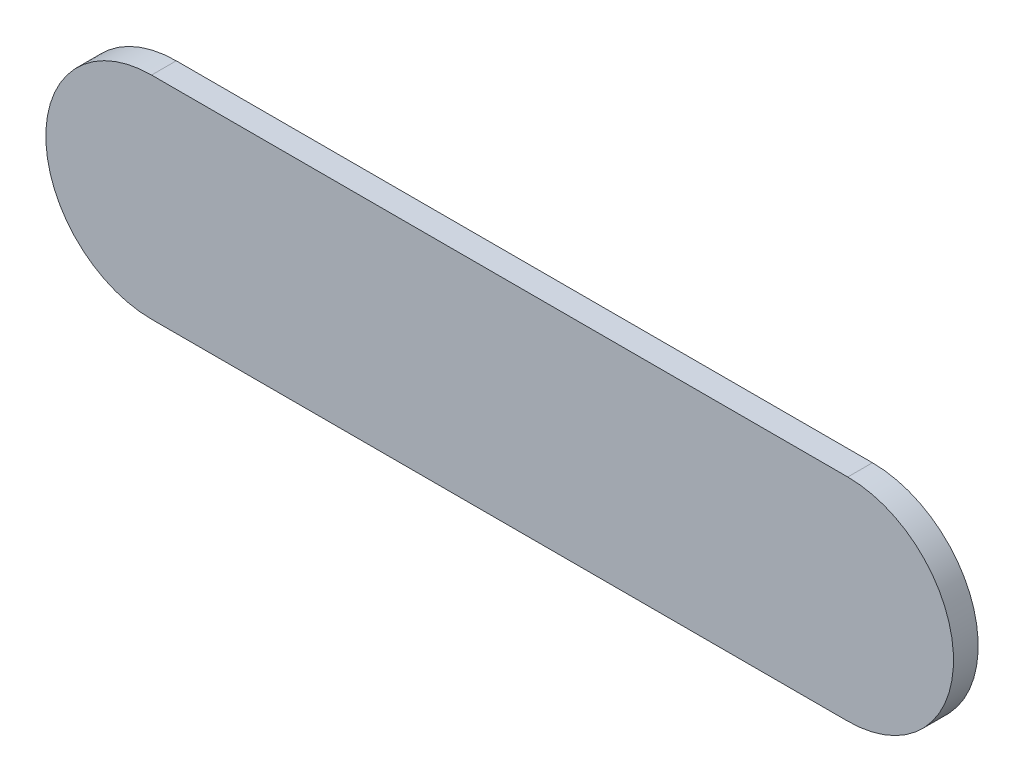
ISO-10303-21;
HEADER;
FILE_DESCRIPTION(('STEP AP214'),'2;1');
FILE_NAME('part.step','',(''),(''),'','','');
FILE_SCHEMA(('AUTOMOTIVE_DESIGN { 1 0 10303 214 1 1 1 1 }'));
ENDSEC;
DATA;
#1=APPLICATION_CONTEXT('core data for automotive mechanical design processes');
#2=APPLICATION_PROTOCOL_DEFINITION('international standard','automotive_design',2000,#1);
#3=PRODUCT_CONTEXT('',#1,'mechanical');
#4=PRODUCT('Part','Part','',(#3));
#5=PRODUCT_RELATED_PRODUCT_CATEGORY('part','',(#4));
#6=PRODUCT_DEFINITION_FORMATION('','',#4);
#7=PRODUCT_DEFINITION_CONTEXT('part definition',#1,'design');
#8=PRODUCT_DEFINITION('design','',#6,#7);
#9=PRODUCT_DEFINITION_SHAPE('','',#8);
#10=(LENGTH_UNIT() NAMED_UNIT(*) SI_UNIT(.MILLI.,.METRE.));
#11=(NAMED_UNIT(*) PLANE_ANGLE_UNIT() SI_UNIT($,.RADIAN.));
#12=(NAMED_UNIT(*) SI_UNIT($,.STERADIAN.) SOLID_ANGLE_UNIT());
#13=UNCERTAINTY_MEASURE_WITH_UNIT(LENGTH_MEASURE(1.E-05),#10,'distance_accuracy_value','');
#14=(GEOMETRIC_REPRESENTATION_CONTEXT(3) GLOBAL_UNCERTAINTY_ASSIGNED_CONTEXT((#13)) GLOBAL_UNIT_ASSIGNED_CONTEXT((#10,
#11,#12)) REPRESENTATION_CONTEXT('',''));
#15=CARTESIAN_POINT('',(0.,0.,0.));
#16=DIRECTION('',(0.,0.,1.));
#17=DIRECTION('',(1.,0.,0.));
#18=AXIS2_PLACEMENT_3D('',#15,#16,#17);
#19=CARTESIAN_POINT('',(131.4125,-63.65,1.635));
#20=DIRECTION('',(0.,0.,1.));
#21=DIRECTION('',(1.,0.,0.));
#22=AXIS2_PLACEMENT_3D('',#19,#20,#21);
#23=PLANE('',#22);
#24=DIRECTION('',(1.,0.,0.));
#25=VECTOR('',#24,1.);
#26=CARTESIAN_POINT('',(131.4125,-63.65,1.635));
#27=LINE('',#26,#25);
#28=CARTESIAN_POINT('',(131.4125,-63.65,1.635));
#29=VERTEX_POINT('',#28);
#30=CARTESIAN_POINT('',(132.4,-63.65,1.635));
#31=VERTEX_POINT('',#30);
#32=EDGE_CURVE('E70',#29,#31,#27,.T.);
#33=ORIENTED_EDGE('',*,*,#32,.T.);
#34=CARTESIAN_POINT('',(132.4,-63.5,1.635));
#35=DIRECTION('',(0.,0.,1.));
#36=DIRECTION('',(-1.894780628694E-13,-1.,0.));
#37=AXIS2_PLACEMENT_3D('',#34,#35,#36);
#38=CIRCLE('',#37,0.15);
#39=CARTESIAN_POINT('',(132.4,-63.35,1.635));
#40=VERTEX_POINT('',#39);
#41=EDGE_CURVE('E96',#31,#40,#38,.T.);
#42=ORIENTED_EDGE('',*,*,#41,.T.);
#43=DIRECTION('',(-1.,0.,0.));
#44=VECTOR('',#43,1.);
#45=CARTESIAN_POINT('',(132.4,-63.35,1.635));
#46=LINE('',#45,#44);
#47=CARTESIAN_POINT('',(131.4125,-63.35,1.635));
#48=VERTEX_POINT('',#47);
#49=EDGE_CURVE('E72',#40,#48,#46,.T.);
#50=ORIENTED_EDGE('',*,*,#49,.T.);
#51=CARTESIAN_POINT('',(131.4125,-63.5,1.635));
#52=DIRECTION('',(0.,0.,1.));
#53=DIRECTION('',(1.894780628694E-13,1.,0.));
#54=AXIS2_PLACEMENT_3D('',#51,#52,#53);
#55=CIRCLE('',#54,0.15);
#56=EDGE_CURVE('E11',#48,#29,#55,.T.);
#57=ORIENTED_EDGE('',*,*,#56,.T.);
#58=EDGE_LOOP('',(#33,#42,#50,#57));
#59=FACE_BOUND('',#58,.T.);
#60=ADVANCED_FACE('F17',(#59),#23,.T.);
#61=CARTESIAN_POINT('',(131.4125,-63.65,1.6));
#62=DIRECTION('',(0.,0.,1.));
#63=DIRECTION('',(1.,0.,0.));
#64=AXIS2_PLACEMENT_3D('',#61,#62,#63);
#65=PLANE('',#64);
#66=CARTESIAN_POINT('',(131.4125,-63.5,1.6));
#67=DIRECTION('',(0.,0.,1.));
#68=DIRECTION('',(1.894780628694E-13,1.,0.));
#69=AXIS2_PLACEMENT_3D('',#66,#67,#68);
#70=CIRCLE('',#69,0.15);
#71=CARTESIAN_POINT('',(131.4125,-63.35,1.6));
#72=VERTEX_POINT('',#71);
#73=CARTESIAN_POINT('',(131.4125,-63.65,1.6));
#74=VERTEX_POINT('',#73);
#75=EDGE_CURVE('E20',#72,#74,#70,.T.);
#76=ORIENTED_EDGE('',*,*,#75,.F.);
#77=DIRECTION('',(-1.,0.,0.));
#78=VECTOR('',#77,1.);
#79=CARTESIAN_POINT('',(132.4,-63.35,1.6));
#80=LINE('',#79,#78);
#81=CARTESIAN_POINT('',(132.4,-63.35,1.6));
#82=VERTEX_POINT('',#81);
#83=EDGE_CURVE('E99',#82,#72,#80,.T.);
#84=ORIENTED_EDGE('',*,*,#83,.F.);
#85=CARTESIAN_POINT('',(132.4,-63.5,1.6));
#86=DIRECTION('',(0.,0.,1.));
#87=DIRECTION('',(-1.894780628694E-13,-1.,0.));
#88=AXIS2_PLACEMENT_3D('',#85,#86,#87);
#89=CIRCLE('',#88,0.15);
#90=CARTESIAN_POINT('',(132.4,-63.65,1.6));
#91=VERTEX_POINT('',#90);
#92=EDGE_CURVE('E80',#91,#82,#89,.T.);
#93=ORIENTED_EDGE('',*,*,#92,.F.);
#94=DIRECTION('',(1.,0.,0.));
#95=VECTOR('',#94,1.);
#96=CARTESIAN_POINT('',(131.4125,-63.65,1.6));
#97=LINE('',#96,#95);
#98=EDGE_CURVE('E91',#74,#91,#97,.T.);
#99=ORIENTED_EDGE('',*,*,#98,.F.);
#100=EDGE_LOOP('',(#76,#84,#93,#99));
#101=FACE_BOUND('',#100,.T.);
#102=ADVANCED_FACE('F156',(#101),#65,.F.);
#103=CARTESIAN_POINT('',(131.4125,-63.5,1.6));
#104=DIRECTION('',(0.,0.,-1.));
#105=DIRECTION('',(1.894780628694E-13,1.,0.));
#106=AXIS2_PLACEMENT_3D('',#103,#104,#105);
#107=CYLINDRICAL_SURFACE('',#106,0.15);
#108=ORIENTED_EDGE('',*,*,#75,.T.);
#109=DIRECTION('',(0.,0.,1.));
#110=VECTOR('',#109,1.);
#111=CARTESIAN_POINT('',(131.4125,-63.65,1.6));
#112=LINE('',#111,#110);
#113=EDGE_CURVE('E75',#74,#29,#112,.T.);
#114=ORIENTED_EDGE('',*,*,#113,.T.);
#115=ORIENTED_EDGE('',*,*,#56,.F.);
#116=DIRECTION('',(0.,0.,1.));
#117=VECTOR('',#116,1.);
#118=CARTESIAN_POINT('',(131.4125,-63.35,1.6));
#119=LINE('',#118,#117);
#120=EDGE_CURVE('E107',#72,#48,#119,.T.);
#121=ORIENTED_EDGE('',*,*,#120,.F.);
#122=EDGE_LOOP('',(#108,#114,#115,#121));
#123=FACE_BOUND('',#122,.T.);
#124=ADVANCED_FACE('F76',(#123),#107,.T.);
#125=CARTESIAN_POINT('',(132.4,-63.35,1.6));
#126=DIRECTION('',(0.,-1.,0.));
#127=DIRECTION('',(0.,0.,-1.));
#128=AXIS2_PLACEMENT_3D('',#125,#126,#127);
#129=PLANE('',#128);
#130=ORIENTED_EDGE('',*,*,#83,.T.);
#131=ORIENTED_EDGE('',*,*,#120,.T.);
#132=ORIENTED_EDGE('',*,*,#49,.F.);
#133=DIRECTION('',(0.,0.,1.));
#134=VECTOR('',#133,1.);
#135=CARTESIAN_POINT('',(132.4,-63.35,1.6));
#136=LINE('',#135,#134);
#137=EDGE_CURVE('E100',#82,#40,#136,.T.);
#138=ORIENTED_EDGE('',*,*,#137,.F.);
#139=EDGE_LOOP('',(#130,#131,#132,#138));
#140=FACE_BOUND('',#139,.T.);
#141=ADVANCED_FACE('F138',(#140),#129,.F.);
#142=CARTESIAN_POINT('',(132.4,-63.5,1.6));
#143=DIRECTION('',(0.,0.,-1.));
#144=DIRECTION('',(-1.894780628694E-13,-1.,0.));
#145=AXIS2_PLACEMENT_3D('',#142,#143,#144);
#146=CYLINDRICAL_SURFACE('',#145,0.15);
#147=ORIENTED_EDGE('',*,*,#92,.T.);
#148=ORIENTED_EDGE('',*,*,#137,.T.);
#149=ORIENTED_EDGE('',*,*,#41,.F.);
#150=DIRECTION('',(0.,0.,1.));
#151=VECTOR('',#150,1.);
#152=CARTESIAN_POINT('',(132.4,-63.65,1.6));
#153=LINE('',#152,#151);
#154=EDGE_CURVE('E84',#91,#31,#153,.T.);
#155=ORIENTED_EDGE('',*,*,#154,.F.);
#156=EDGE_LOOP('',(#147,#148,#149,#155));
#157=FACE_BOUND('',#156,.T.);
#158=ADVANCED_FACE('F128',(#157),#146,.T.);
#159=CARTESIAN_POINT('',(131.4125,-63.65,1.6));
#160=DIRECTION('',(0.,1.,0.));
#161=DIRECTION('',(1.,0.,0.));
#162=AXIS2_PLACEMENT_3D('',#159,#160,#161);
#163=PLANE('',#162);
#164=ORIENTED_EDGE('',*,*,#98,.T.);
#165=ORIENTED_EDGE('',*,*,#154,.T.);
#166=ORIENTED_EDGE('',*,*,#32,.F.);
#167=ORIENTED_EDGE('',*,*,#113,.F.);
#168=EDGE_LOOP('',(#164,#165,#166,#167));
#169=FACE_BOUND('',#168,.T.);
#170=ADVANCED_FACE('F82',(#169),#163,.F.);
#171=CLOSED_SHELL('',(#60,#102,#124,#141,#158,#170));
#172=MANIFOLD_SOLID_BREP('B1',#171);
#173=ADVANCED_BREP_SHAPE_REPRESENTATION('',(#18,#172),#14);
#174=SHAPE_DEFINITION_REPRESENTATION(#9,#173);
ENDSEC;
END-ISO-10303-21;
